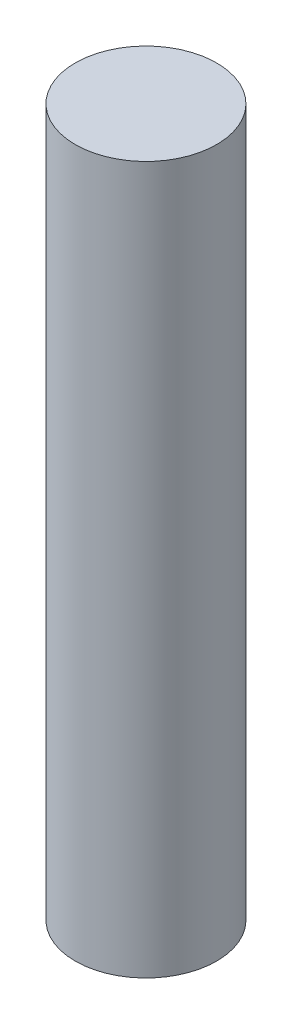
ISO-10303-21;
HEADER;
FILE_DESCRIPTION(('STEP AP214'),'2;1');
FILE_NAME('part.step','',(''),(''),'','','');
FILE_SCHEMA(('AUTOMOTIVE_DESIGN { 1 0 10303 214 1 1 1 1 }'));
ENDSEC;
DATA;
#1=APPLICATION_CONTEXT('core data for automotive mechanical design processes');
#2=APPLICATION_PROTOCOL_DEFINITION('international standard','automotive_design',2000,#1);
#3=PRODUCT_CONTEXT('',#1,'mechanical');
#4=PRODUCT('Part','Part','',(#3));
#5=PRODUCT_RELATED_PRODUCT_CATEGORY('part','',(#4));
#6=PRODUCT_DEFINITION_FORMATION('','',#4);
#7=PRODUCT_DEFINITION_CONTEXT('part definition',#1,'design');
#8=PRODUCT_DEFINITION('design','',#6,#7);
#9=PRODUCT_DEFINITION_SHAPE('','',#8);
#10=(LENGTH_UNIT() NAMED_UNIT(*) SI_UNIT(.MILLI.,.METRE.));
#11=(NAMED_UNIT(*) PLANE_ANGLE_UNIT() SI_UNIT($,.RADIAN.));
#12=(NAMED_UNIT(*) SI_UNIT($,.STERADIAN.) SOLID_ANGLE_UNIT());
#13=UNCERTAINTY_MEASURE_WITH_UNIT(LENGTH_MEASURE(1.E-05),#10,'distance_accuracy_value','');
#14=(GEOMETRIC_REPRESENTATION_CONTEXT(3) GLOBAL_UNCERTAINTY_ASSIGNED_CONTEXT((#13)) GLOBAL_UNIT_ASSIGNED_CONTEXT((#10,
#11,#12)) REPRESENTATION_CONTEXT('',''));
#15=CARTESIAN_POINT('',(0.,0.,0.));
#16=DIRECTION('',(0.,0.,1.));
#17=DIRECTION('',(1.,0.,0.));
#18=AXIS2_PLACEMENT_3D('',#15,#16,#17);
#19=CARTESIAN_POINT('',(0.,60.,0.));
#20=DIRECTION('',(0.,-1.,0.));
#21=DIRECTION('',(0.,0.,-1.));
#22=AXIS2_PLACEMENT_3D('',#19,#20,#21);
#23=CYLINDRICAL_SURFACE('',#22,6.);
#24=CARTESIAN_POINT('',(0.,60.,0.));
#25=DIRECTION('',(0.,1.,0.));
#26=DIRECTION('',(0.,0.,1.));
#27=AXIS2_PLACEMENT_3D('',#24,#25,#26);
#28=CIRCLE('',#27,6.);
#29=CARTESIAN_POINT('',(0.,60.,6.));
#30=VERTEX_POINT('',#29);
#31=EDGE_CURVE('E10',#30,#30,#28,.T.);
#32=ORIENTED_EDGE('',*,*,#31,.F.);
#33=EDGE_LOOP('',(#32));
#34=FACE_BOUND('',#33,.T.);
#35=CARTESIAN_POINT('',(0.,0.,0.));
#36=DIRECTION('',(0.,1.,0.));
#37=DIRECTION('',(0.,0.,1.));
#38=AXIS2_PLACEMENT_3D('',#35,#36,#37);
#39=CIRCLE('',#38,6.);
#40=CARTESIAN_POINT('',(0.,0.,6.));
#41=VERTEX_POINT('',#40);
#42=EDGE_CURVE('E38',#41,#41,#39,.T.);
#43=ORIENTED_EDGE('',*,*,#42,.T.);
#44=EDGE_LOOP('',(#43));
#45=FACE_BOUND('',#44,.T.);
#46=ADVANCED_FACE('F35',(#34,#45),#23,.T.);
#47=CARTESIAN_POINT('',(0.,60.,0.));
#48=DIRECTION('',(0.,1.,0.));
#49=DIRECTION('',(0.,0.,1.));
#50=AXIS2_PLACEMENT_3D('',#47,#48,#49);
#51=PLANE('',#50);
#52=ORIENTED_EDGE('',*,*,#31,.T.);
#53=EDGE_LOOP('',(#52));
#54=FACE_BOUND('',#53,.T.);
#55=ADVANCED_FACE('F50',(#54),#51,.T.);
#56=CARTESIAN_POINT('',(0.,0.,0.));
#57=DIRECTION('',(0.,1.,0.));
#58=DIRECTION('',(0.,0.,1.));
#59=AXIS2_PLACEMENT_3D('',#56,#57,#58);
#60=PLANE('',#59);
#61=ORIENTED_EDGE('',*,*,#42,.F.);
#62=EDGE_LOOP('',(#61));
#63=FACE_BOUND('',#62,.T.);
#64=ADVANCED_FACE('F48',(#63),#60,.F.);
#65=CLOSED_SHELL('',(#46,#55,#64));
#66=MANIFOLD_SOLID_BREP('B2',#65);
#67=ADVANCED_BREP_SHAPE_REPRESENTATION('',(#18,#66),#14);
#68=SHAPE_DEFINITION_REPRESENTATION(#9,#67);
ENDSEC;
END-ISO-10303-21;
